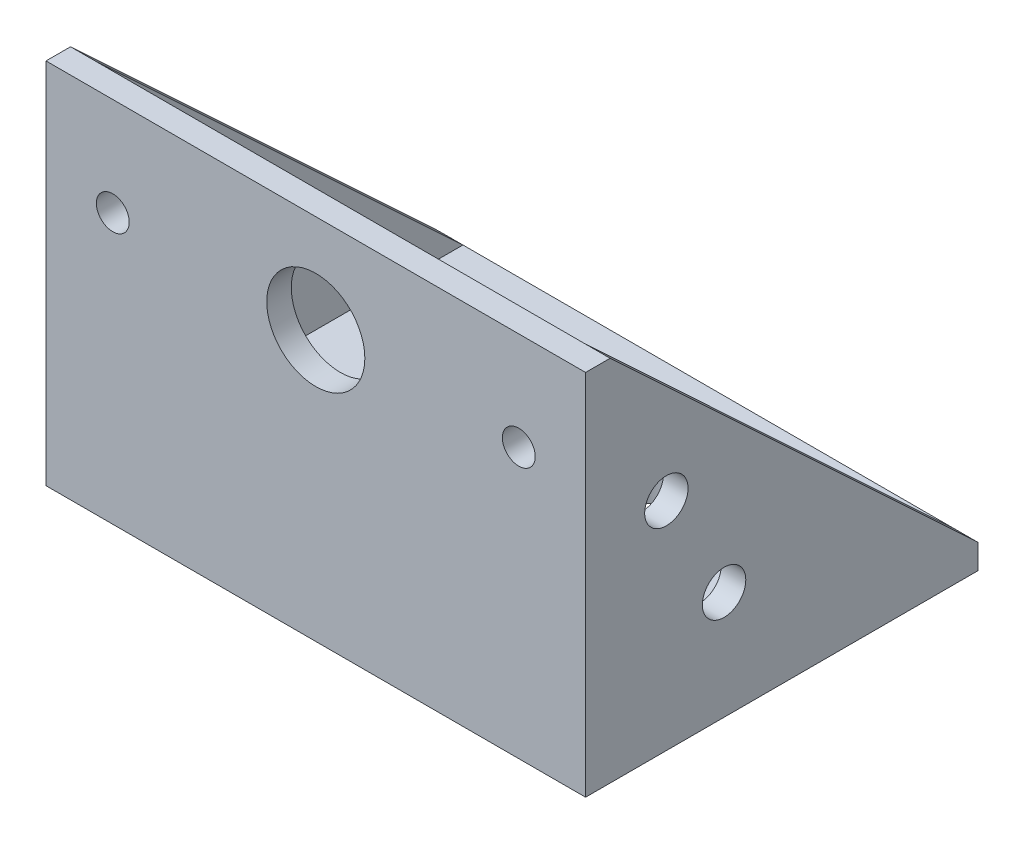
ISO-10303-21;
HEADER;
FILE_DESCRIPTION(('STEP AP214'),'2;1');
FILE_NAME('part.step','',(''),(''),'','','');
FILE_SCHEMA(('AUTOMOTIVE_DESIGN { 1 0 10303 214 1 1 1 1 }'));
ENDSEC;
DATA;
#1=APPLICATION_CONTEXT('core data for automotive mechanical design processes');
#2=APPLICATION_PROTOCOL_DEFINITION('international standard','automotive_design',2000,#1);
#3=PRODUCT_CONTEXT('',#1,'mechanical');
#4=PRODUCT('Part','Part','',(#3));
#5=PRODUCT_RELATED_PRODUCT_CATEGORY('part','',(#4));
#6=PRODUCT_DEFINITION_FORMATION('','',#4);
#7=PRODUCT_DEFINITION_CONTEXT('part definition',#1,'design');
#8=PRODUCT_DEFINITION('design','',#6,#7);
#9=PRODUCT_DEFINITION_SHAPE('','',#8);
#10=(LENGTH_UNIT() NAMED_UNIT(*) SI_UNIT(.MILLI.,.METRE.));
#11=(NAMED_UNIT(*) PLANE_ANGLE_UNIT() SI_UNIT($,.RADIAN.));
#12=(NAMED_UNIT(*) SI_UNIT($,.STERADIAN.) SOLID_ANGLE_UNIT());
#13=UNCERTAINTY_MEASURE_WITH_UNIT(LENGTH_MEASURE(1.E-05),#10,'distance_accuracy_value','');
#14=(GEOMETRIC_REPRESENTATION_CONTEXT(3) GLOBAL_UNCERTAINTY_ASSIGNED_CONTEXT((#13)) GLOBAL_UNIT_ASSIGNED_CONTEXT((#10,
#11,#12)) REPRESENTATION_CONTEXT('',''));
#15=CARTESIAN_POINT('',(0.,0.,0.));
#16=DIRECTION('',(0.,0.,1.));
#17=DIRECTION('',(1.,0.,0.));
#18=AXIS2_PLACEMENT_3D('',#15,#16,#17);
#19=CARTESIAN_POINT('',(0.,-2.54,-38.1));
#20=DIRECTION('',(0.,0.,-1.));
#21=DIRECTION('',(-1.,0.,0.));
#22=AXIS2_PLACEMENT_3D('',#19,#20,#21);
#23=PLANE('',#22);
#24=DIRECTION('',(-1.,0.,0.));
#25=VECTOR('',#24,1.);
#26=CARTESIAN_POINT('',(0.,0.,-38.1));
#27=LINE('',#26,#25);
#28=CARTESIAN_POINT('',(50.8,0.,-38.1));
#29=VERTEX_POINT('',#28);
#30=CARTESIAN_POINT('',(0.,0.,-38.1));
#31=VERTEX_POINT('',#30);
#32=EDGE_CURVE('E41',#29,#31,#27,.T.);
#33=ORIENTED_EDGE('',*,*,#32,.F.);
#34=DIRECTION('',(-1.,0.,0.));
#35=VECTOR('',#34,1.);
#36=CARTESIAN_POINT('',(53.34,0.,-38.1));
#37=LINE('',#36,#35);
#38=CARTESIAN_POINT('',(53.34,0.,-38.1));
#39=VERTEX_POINT('',#38);
#40=EDGE_CURVE('E155',#39,#29,#37,.T.);
#41=ORIENTED_EDGE('',*,*,#40,.F.);
#42=DIRECTION('',(0.,1.,0.));
#43=VECTOR('',#42,1.);
#44=CARTESIAN_POINT('',(53.34,-2.54,-38.1));
#45=LINE('',#44,#43);
#46=CARTESIAN_POINT('',(53.34,-2.54,-38.1));
#47=VERTEX_POINT('',#46);
#48=EDGE_CURVE('E153',#47,#39,#45,.T.);
#49=ORIENTED_EDGE('',*,*,#48,.F.);
#50=DIRECTION('',(-1.,0.,0.));
#51=VECTOR('',#50,1.);
#52=CARTESIAN_POINT('',(0.,-2.54,-38.1));
#53=LINE('',#52,#51);
#54=CARTESIAN_POINT('',(-2.54,-2.54,-38.1));
#55=VERTEX_POINT('',#54);
#56=EDGE_CURVE('E11',#47,#55,#53,.T.);
#57=ORIENTED_EDGE('',*,*,#56,.T.);
#58=DIRECTION('',(0.,-1.,0.));
#59=VECTOR('',#58,1.);
#60=CARTESIAN_POINT('',(-2.54,0.,-38.1));
#61=LINE('',#60,#59);
#62=CARTESIAN_POINT('',(-2.54,0.,-38.1));
#63=VERTEX_POINT('',#62);
#64=EDGE_CURVE('E107',#63,#55,#61,.T.);
#65=ORIENTED_EDGE('',*,*,#64,.F.);
#66=DIRECTION('',(1.,0.,0.));
#67=VECTOR('',#66,1.);
#68=CARTESIAN_POINT('',(-2.54,0.,-38.1));
#69=LINE('',#68,#67);
#70=EDGE_CURVE('E103',#63,#31,#69,.T.);
#71=ORIENTED_EDGE('',*,*,#70,.T.);
#72=EDGE_LOOP('',(#33,#41,#49,#57,#65,#71));
#73=FACE_BOUND('',#72,.T.);
#74=ADVANCED_FACE('F33',(#73),#23,.T.);
#75=CARTESIAN_POINT('',(0.,-2.54,-38.1));
#76=DIRECTION('',(0.,-1.,0.));
#77=DIRECTION('',(0.,0.,-1.));
#78=AXIS2_PLACEMENT_3D('',#75,#76,#77);
#79=PLANE('',#78);
#80=CARTESIAN_POINT('',(44.45,-2.54,-25.4));
#81=DIRECTION('',(0.,1.,0.));
#82=DIRECTION('',(0.,0.,1.));
#83=AXIS2_PLACEMENT_3D('',#80,#81,#82);
#84=CIRCLE('',#83,2.2479);
#85=CARTESIAN_POINT('',(44.45,-2.54,-23.1521));
#86=VERTEX_POINT('',#85);
#87=EDGE_CURVE('E196',#86,#86,#84,.T.);
#88=ORIENTED_EDGE('',*,*,#87,.T.);
#89=EDGE_LOOP('',(#88));
#90=FACE_BOUND('',#89,.T.);
#91=CARTESIAN_POINT('',(31.75,-2.54,-25.4));
#92=DIRECTION('',(0.,1.,0.));
#93=DIRECTION('',(0.,0.,1.));
#94=AXIS2_PLACEMENT_3D('',#91,#92,#93);
#95=CIRCLE('',#94,2.2479);
#96=CARTESIAN_POINT('',(31.75,-2.54,-23.1521));
#97=VERTEX_POINT('',#96);
#98=EDGE_CURVE('E202',#97,#97,#95,.T.);
#99=ORIENTED_EDGE('',*,*,#98,.T.);
#100=EDGE_LOOP('',(#99));
#101=FACE_BOUND('',#100,.T.);
#102=CARTESIAN_POINT('',(19.05,-2.54,-25.4));
#103=DIRECTION('',(0.,1.,0.));
#104=DIRECTION('',(0.,0.,1.));
#105=AXIS2_PLACEMENT_3D('',#102,#103,#104);
#106=CIRCLE('',#105,2.2479);
#107=CARTESIAN_POINT('',(19.05,-2.54,-23.1521));
#108=VERTEX_POINT('',#107);
#109=EDGE_CURVE('E208',#108,#108,#106,.T.);
#110=ORIENTED_EDGE('',*,*,#109,.T.);
#111=EDGE_LOOP('',(#110));
#112=FACE_BOUND('',#111,.T.);
#113=CARTESIAN_POINT('',(6.35,-2.54,-25.4));
#114=DIRECTION('',(0.,1.,0.));
#115=DIRECTION('',(0.,0.,1.));
#116=AXIS2_PLACEMENT_3D('',#113,#114,#115);
#117=CIRCLE('',#116,2.2479);
#118=CARTESIAN_POINT('',(6.35,-2.54,-23.1521));
#119=VERTEX_POINT('',#118);
#120=EDGE_CURVE('E214',#119,#119,#117,.T.);
#121=ORIENTED_EDGE('',*,*,#120,.T.);
#122=EDGE_LOOP('',(#121));
#123=FACE_BOUND('',#122,.T.);
#124=DIRECTION('',(1.,0.,0.));
#125=VECTOR('',#124,1.);
#126=CARTESIAN_POINT('',(0.,-2.54,2.54));
#127=LINE('',#126,#125);
#128=CARTESIAN_POINT('',(-2.54,-2.54,2.54));
#129=VERTEX_POINT('',#128);
#130=CARTESIAN_POINT('',(53.34,-2.54,2.54));
#131=VERTEX_POINT('',#130);
#132=EDGE_CURVE('E181',#129,#131,#127,.T.);
#133=ORIENTED_EDGE('',*,*,#132,.F.);
#134=DIRECTION('',(0.,0.,1.));
#135=VECTOR('',#134,1.);
#136=CARTESIAN_POINT('',(-2.54,-2.54,-38.1));
#137=LINE('',#136,#135);
#138=EDGE_CURVE('E241',#55,#129,#137,.T.);
#139=ORIENTED_EDGE('',*,*,#138,.F.);
#140=ORIENTED_EDGE('',*,*,#56,.F.);
#141=DIRECTION('',(0.,0.,-1.));
#142=VECTOR('',#141,1.);
#143=CARTESIAN_POINT('',(53.34,-2.54,2.54));
#144=LINE('',#143,#142);
#145=EDGE_CURVE('E150',#131,#47,#144,.T.);
#146=ORIENTED_EDGE('',*,*,#145,.F.);
#147=EDGE_LOOP('',(#133,#139,#140,#146));
#148=FACE_BOUND('',#147,.T.);
#149=ADVANCED_FACE('F270',(#90,#101,#112,#123,#148),#79,.T.);
#150=CARTESIAN_POINT('',(0.,0.,-38.1));
#151=DIRECTION('',(0.,-1.,0.));
#152=DIRECTION('',(0.,0.,-1.));
#153=AXIS2_PLACEMENT_3D('',#150,#151,#152);
#154=PLANE('',#153);
#155=CARTESIAN_POINT('',(44.45,0.,-25.4));
#156=DIRECTION('',(0.,1.,0.));
#157=DIRECTION('',(0.,0.,1.));
#158=AXIS2_PLACEMENT_3D('',#155,#156,#157);
#159=CIRCLE('',#158,2.2479);
#160=CARTESIAN_POINT('',(44.45,0.,-23.1521));
#161=VERTEX_POINT('',#160);
#162=EDGE_CURVE('E185',#161,#161,#159,.T.);
#163=ORIENTED_EDGE('',*,*,#162,.F.);
#164=EDGE_LOOP('',(#163));
#165=FACE_BOUND('',#164,.T.);
#166=CARTESIAN_POINT('',(31.75,0.,-25.4));
#167=DIRECTION('',(0.,1.,0.));
#168=DIRECTION('',(0.,0.,1.));
#169=AXIS2_PLACEMENT_3D('',#166,#167,#168);
#170=CIRCLE('',#169,2.2479);
#171=CARTESIAN_POINT('',(31.75,0.,-23.1521));
#172=VERTEX_POINT('',#171);
#173=EDGE_CURVE('E199',#172,#172,#170,.T.);
#174=ORIENTED_EDGE('',*,*,#173,.F.);
#175=EDGE_LOOP('',(#174));
#176=FACE_BOUND('',#175,.T.);
#177=CARTESIAN_POINT('',(19.05,0.,-25.4));
#178=DIRECTION('',(0.,1.,0.));
#179=DIRECTION('',(0.,0.,1.));
#180=AXIS2_PLACEMENT_3D('',#177,#178,#179);
#181=CIRCLE('',#180,2.2479);
#182=CARTESIAN_POINT('',(19.05,0.,-23.1521));
#183=VERTEX_POINT('',#182);
#184=EDGE_CURVE('E205',#183,#183,#181,.T.);
#185=ORIENTED_EDGE('',*,*,#184,.F.);
#186=EDGE_LOOP('',(#185));
#187=FACE_BOUND('',#186,.T.);
#188=CARTESIAN_POINT('',(6.35,0.,-25.4));
#189=DIRECTION('',(0.,1.,0.));
#190=DIRECTION('',(0.,0.,1.));
#191=AXIS2_PLACEMENT_3D('',#188,#189,#190);
#192=CIRCLE('',#191,2.2479);
#193=CARTESIAN_POINT('',(6.35,0.,-23.1521));
#194=VERTEX_POINT('',#193);
#195=EDGE_CURVE('E211',#194,#194,#192,.T.);
#196=ORIENTED_EDGE('',*,*,#195,.F.);
#197=EDGE_LOOP('',(#196));
#198=FACE_BOUND('',#197,.T.);
#199=DIRECTION('',(0.,0.,1.));
#200=VECTOR('',#199,1.);
#201=CARTESIAN_POINT('',(0.,0.,0.));
#202=LINE('',#201,#200);
#203=CARTESIAN_POINT('',(0.,0.,0.));
#204=VERTEX_POINT('',#203);
#205=EDGE_CURVE('E217',#31,#204,#202,.T.);
#206=ORIENTED_EDGE('',*,*,#205,.T.);
#207=DIRECTION('',(1.,0.,0.));
#208=VECTOR('',#207,1.);
#209=CARTESIAN_POINT('',(0.,0.,0.));
#210=LINE('',#209,#208);
#211=CARTESIAN_POINT('',(50.8,0.,0.));
#212=VERTEX_POINT('',#211);
#213=EDGE_CURVE('E224',#204,#212,#210,.T.);
#214=ORIENTED_EDGE('',*,*,#213,.T.);
#215=DIRECTION('',(0.,0.,-1.));
#216=VECTOR('',#215,1.);
#217=CARTESIAN_POINT('',(50.8,0.,0.));
#218=LINE('',#217,#216);
#219=EDGE_CURVE('E53',#212,#29,#218,.T.);
#220=ORIENTED_EDGE('',*,*,#219,.T.);
#221=ORIENTED_EDGE('',*,*,#32,.T.);
#222=EDGE_LOOP('',(#206,#214,#220,#221));
#223=FACE_BOUND('',#222,.T.);
#224=ADVANCED_FACE('F228',(#165,#176,#187,#198,#223),#154,.F.);
#225=CARTESIAN_POINT('',(6.35,-2.54,-25.4));
#226=DIRECTION('',(0.,1.,0.));
#227=DIRECTION('',(0.,0.,1.));
#228=AXIS2_PLACEMENT_3D('',#225,#226,#227);
#229=CYLINDRICAL_SURFACE('',#228,2.2479);
#230=ORIENTED_EDGE('',*,*,#120,.F.);
#231=EDGE_LOOP('',(#230));
#232=FACE_BOUND('',#231,.T.);
#233=ORIENTED_EDGE('',*,*,#195,.T.);
#234=EDGE_LOOP('',(#233));
#235=FACE_BOUND('',#234,.T.);
#236=ADVANCED_FACE('F342',(#232,#235),#229,.F.);
#237=CARTESIAN_POINT('',(19.05,-2.54,-25.4));
#238=DIRECTION('',(0.,1.,0.));
#239=DIRECTION('',(0.,0.,1.));
#240=AXIS2_PLACEMENT_3D('',#237,#238,#239);
#241=CYLINDRICAL_SURFACE('',#240,2.2479);
#242=ORIENTED_EDGE('',*,*,#109,.F.);
#243=EDGE_LOOP('',(#242));
#244=FACE_BOUND('',#243,.T.);
#245=ORIENTED_EDGE('',*,*,#184,.T.);
#246=EDGE_LOOP('',(#245));
#247=FACE_BOUND('',#246,.T.);
#248=ADVANCED_FACE('F338',(#244,#247),#241,.F.);
#249=CARTESIAN_POINT('',(31.75,-2.54,-25.4));
#250=DIRECTION('',(0.,1.,0.));
#251=DIRECTION('',(0.,0.,1.));
#252=AXIS2_PLACEMENT_3D('',#249,#250,#251);
#253=CYLINDRICAL_SURFACE('',#252,2.2479);
#254=ORIENTED_EDGE('',*,*,#98,.F.);
#255=EDGE_LOOP('',(#254));
#256=FACE_BOUND('',#255,.T.);
#257=ORIENTED_EDGE('',*,*,#173,.T.);
#258=EDGE_LOOP('',(#257));
#259=FACE_BOUND('',#258,.T.);
#260=ADVANCED_FACE('F334',(#256,#259),#253,.F.);
#261=CARTESIAN_POINT('',(44.45,-2.54,-25.4));
#262=DIRECTION('',(0.,1.,0.));
#263=DIRECTION('',(0.,0.,1.));
#264=AXIS2_PLACEMENT_3D('',#261,#262,#263);
#265=CYLINDRICAL_SURFACE('',#264,2.2479);
#266=ORIENTED_EDGE('',*,*,#87,.F.);
#267=EDGE_LOOP('',(#266));
#268=FACE_BOUND('',#267,.T.);
#269=ORIENTED_EDGE('',*,*,#162,.T.);
#270=EDGE_LOOP('',(#269));
#271=FACE_BOUND('',#270,.T.);
#272=ADVANCED_FACE('F313',(#268,#271),#265,.F.);
#273=CARTESIAN_POINT('',(0.,35.56,0.));
#274=DIRECTION('',(0.,0.,-1.));
#275=DIRECTION('',(-1.,0.,0.));
#276=AXIS2_PLACEMENT_3D('',#273,#274,#275);
#277=PLANE('',#276);
#278=CARTESIAN_POINT('',(46.42358,25.4,0.));
#279=DIRECTION('',(0.,0.,1.));
#280=DIRECTION('',(1.,0.,0.));
#281=AXIS2_PLACEMENT_3D('',#278,#279,#280);
#282=CIRCLE('',#281,1.7018);
#283=CARTESIAN_POINT('',(48.12538,25.4,0.));
#284=VERTEX_POINT('',#283);
#285=EDGE_CURVE('E162',#284,#284,#282,.T.);
#286=ORIENTED_EDGE('',*,*,#285,.T.);
#287=EDGE_LOOP('',(#286));
#288=FACE_BOUND('',#287,.T.);
#289=CARTESIAN_POINT('',(25.4,25.4,0.));
#290=DIRECTION('',(0.,0.,1.));
#291=DIRECTION('',(1.,0.,0.));
#292=AXIS2_PLACEMENT_3D('',#289,#290,#291);
#293=CIRCLE('',#292,5.08);
#294=CARTESIAN_POINT('',(30.48,25.4,0.));
#295=VERTEX_POINT('',#294);
#296=EDGE_CURVE('E172',#295,#295,#293,.T.);
#297=ORIENTED_EDGE('',*,*,#296,.T.);
#298=EDGE_LOOP('',(#297));
#299=FACE_BOUND('',#298,.T.);
#300=CARTESIAN_POINT('',(4.37642,25.4,0.));
#301=DIRECTION('',(0.,0.,1.));
#302=DIRECTION('',(1.,0.,0.));
#303=AXIS2_PLACEMENT_3D('',#300,#301,#302);
#304=CIRCLE('',#303,1.7018);
#305=CARTESIAN_POINT('',(6.07822,25.4,0.));
#306=VERTEX_POINT('',#305);
#307=EDGE_CURVE('E166',#306,#306,#304,.T.);
#308=ORIENTED_EDGE('',*,*,#307,.T.);
#309=EDGE_LOOP('',(#308));
#310=FACE_BOUND('',#309,.T.);
#311=ORIENTED_EDGE('',*,*,#213,.F.);
#312=DIRECTION('',(0.,-1.,0.));
#313=VECTOR('',#312,1.);
#314=CARTESIAN_POINT('',(0.,-2.54,0.));
#315=LINE('',#314,#313);
#316=CARTESIAN_POINT('',(0.,35.56,0.));
#317=VERTEX_POINT('',#316);
#318=EDGE_CURVE('E178',#317,#204,#315,.T.);
#319=ORIENTED_EDGE('',*,*,#318,.F.);
#320=DIRECTION('',(-1.,0.,0.));
#321=VECTOR('',#320,1.);
#322=CARTESIAN_POINT('',(0.,35.56,0.));
#323=LINE('',#322,#321);
#324=CARTESIAN_POINT('',(50.8,35.56,0.));
#325=VERTEX_POINT('',#324);
#326=EDGE_CURVE('E122',#325,#317,#323,.T.);
#327=ORIENTED_EDGE('',*,*,#326,.F.);
#328=DIRECTION('',(0.,1.,0.));
#329=VECTOR('',#328,1.);
#330=CARTESIAN_POINT('',(50.8,-2.54,0.));
#331=LINE('',#330,#329);
#332=EDGE_CURVE('E193',#212,#325,#331,.T.);
#333=ORIENTED_EDGE('',*,*,#332,.F.);
#334=EDGE_LOOP('',(#311,#319,#327,#333));
#335=FACE_BOUND('',#334,.T.);
#336=ADVANCED_FACE('F232',(#288,#299,#310,#335),#277,.T.);
#337=CARTESIAN_POINT('',(0.,35.56,2.54));
#338=DIRECTION('',(0.,0.,-1.));
#339=DIRECTION('',(-1.,0.,0.));
#340=AXIS2_PLACEMENT_3D('',#337,#338,#339);
#341=PLANE('',#340);
#342=CARTESIAN_POINT('',(4.37642,25.4,2.54));
#343=DIRECTION('',(0.,0.,1.));
#344=DIRECTION('',(1.,0.,0.));
#345=AXIS2_PLACEMENT_3D('',#342,#343,#344);
#346=CIRCLE('',#345,1.7018);
#347=CARTESIAN_POINT('',(6.07822,25.4,2.54));
#348=VERTEX_POINT('',#347);
#349=EDGE_CURVE('E169',#348,#348,#346,.T.);
#350=ORIENTED_EDGE('',*,*,#349,.F.);
#351=EDGE_LOOP('',(#350));
#352=FACE_BOUND('',#351,.T.);
#353=DIRECTION('',(-1.,0.,0.));
#354=VECTOR('',#353,1.);
#355=CARTESIAN_POINT('',(0.,35.56,2.54));
#356=LINE('',#355,#354);
#357=CARTESIAN_POINT('',(53.34,35.56,2.54));
#358=VERTEX_POINT('',#357);
#359=CARTESIAN_POINT('',(-2.54,35.56,2.54));
#360=VERTEX_POINT('',#359);
#361=EDGE_CURVE('E183',#358,#360,#356,.T.);
#362=ORIENTED_EDGE('',*,*,#361,.T.);
#363=DIRECTION('',(0.,1.,0.));
#364=VECTOR('',#363,1.);
#365=CARTESIAN_POINT('',(-2.54,-2.54,2.54));
#366=LINE('',#365,#364);
#367=EDGE_CURVE('E116',#129,#360,#366,.T.);
#368=ORIENTED_EDGE('',*,*,#367,.F.);
#369=ORIENTED_EDGE('',*,*,#132,.T.);
#370=DIRECTION('',(0.,-1.,0.));
#371=VECTOR('',#370,1.);
#372=CARTESIAN_POINT('',(53.34,35.56,2.54));
#373=LINE('',#372,#371);
#374=EDGE_CURVE('E147',#358,#131,#373,.T.);
#375=ORIENTED_EDGE('',*,*,#374,.F.);
#376=EDGE_LOOP('',(#362,#368,#369,#375));
#377=FACE_BOUND('',#376,.T.);
#378=CARTESIAN_POINT('',(25.4,25.4,2.54));
#379=DIRECTION('',(0.,0.,1.));
#380=DIRECTION('',(1.,0.,0.));
#381=AXIS2_PLACEMENT_3D('',#378,#379,#380);
#382=CIRCLE('',#381,5.08);
#383=CARTESIAN_POINT('',(30.48,25.4,2.54));
#384=VERTEX_POINT('',#383);
#385=EDGE_CURVE('E175',#384,#384,#382,.T.);
#386=ORIENTED_EDGE('',*,*,#385,.F.);
#387=EDGE_LOOP('',(#386));
#388=FACE_BOUND('',#387,.T.);
#389=CARTESIAN_POINT('',(46.42358,25.4,2.54));
#390=DIRECTION('',(0.,0.,1.));
#391=DIRECTION('',(1.,0.,0.));
#392=AXIS2_PLACEMENT_3D('',#389,#390,#391);
#393=CIRCLE('',#392,1.7018);
#394=CARTESIAN_POINT('',(48.12538,25.4,2.54));
#395=VERTEX_POINT('',#394);
#396=EDGE_CURVE('E163',#395,#395,#393,.T.);
#397=ORIENTED_EDGE('',*,*,#396,.F.);
#398=EDGE_LOOP('',(#397));
#399=FACE_BOUND('',#398,.T.);
#400=ADVANCED_FACE('F295',(#352,#377,#388,#399),#341,.F.);
#401=CARTESIAN_POINT('',(0.,35.56,2.54));
#402=DIRECTION('',(0.,-1.,0.));
#403=DIRECTION('',(0.,0.,-1.));
#404=AXIS2_PLACEMENT_3D('',#401,#402,#403);
#405=PLANE('',#404);
#406=ORIENTED_EDGE('',*,*,#326,.T.);
#407=DIRECTION('',(1.,0.,0.));
#408=VECTOR('',#407,1.);
#409=CARTESIAN_POINT('',(-2.54,35.56,0.));
#410=LINE('',#409,#408);
#411=CARTESIAN_POINT('',(-2.54,35.56,0.));
#412=VERTEX_POINT('',#411);
#413=EDGE_CURVE('E101',#412,#317,#410,.T.);
#414=ORIENTED_EDGE('',*,*,#413,.F.);
#415=DIRECTION('',(0.,0.,-1.));
#416=VECTOR('',#415,1.);
#417=CARTESIAN_POINT('',(-2.54,35.56,2.54));
#418=LINE('',#417,#416);
#419=EDGE_CURVE('E108',#360,#412,#418,.T.);
#420=ORIENTED_EDGE('',*,*,#419,.F.);
#421=ORIENTED_EDGE('',*,*,#361,.F.);
#422=DIRECTION('',(0.,0.,1.));
#423=VECTOR('',#422,1.);
#424=CARTESIAN_POINT('',(53.34,35.56,0.));
#425=LINE('',#424,#423);
#426=CARTESIAN_POINT('',(53.34,35.56,0.));
#427=VERTEX_POINT('',#426);
#428=EDGE_CURVE('E144',#427,#358,#425,.T.);
#429=ORIENTED_EDGE('',*,*,#428,.F.);
#430=DIRECTION('',(-1.,0.,0.));
#431=VECTOR('',#430,1.);
#432=CARTESIAN_POINT('',(53.34,35.56,0.));
#433=LINE('',#432,#431);
#434=EDGE_CURVE('E160',#427,#325,#433,.T.);
#435=ORIENTED_EDGE('',*,*,#434,.T.);
#436=EDGE_LOOP('',(#406,#414,#420,#421,#429,#435));
#437=FACE_BOUND('',#436,.T.);
#438=ADVANCED_FACE('F120',(#437),#405,.F.);
#439=CARTESIAN_POINT('',(25.4,25.4,2.54));
#440=DIRECTION('',(0.,0.,-1.));
#441=DIRECTION('',(-1.,0.,0.));
#442=AXIS2_PLACEMENT_3D('',#439,#440,#441);
#443=CYLINDRICAL_SURFACE('',#442,5.08);
#444=ORIENTED_EDGE('',*,*,#385,.T.);
#445=EDGE_LOOP('',(#444));
#446=FACE_BOUND('',#445,.T.);
#447=ORIENTED_EDGE('',*,*,#296,.F.);
#448=EDGE_LOOP('',(#447));
#449=FACE_BOUND('',#448,.T.);
#450=ADVANCED_FACE('F320',(#446,#449),#443,.F.);
#451=CARTESIAN_POINT('',(4.37642,25.4,2.54));
#452=DIRECTION('',(0.,0.,-1.));
#453=DIRECTION('',(-1.,0.,0.));
#454=AXIS2_PLACEMENT_3D('',#451,#452,#453);
#455=CYLINDRICAL_SURFACE('',#454,1.7018);
#456=ORIENTED_EDGE('',*,*,#349,.T.);
#457=EDGE_LOOP('',(#456));
#458=FACE_BOUND('',#457,.T.);
#459=ORIENTED_EDGE('',*,*,#307,.F.);
#460=EDGE_LOOP('',(#459));
#461=FACE_BOUND('',#460,.T.);
#462=ADVANCED_FACE('F307',(#458,#461),#455,.F.);
#463=CARTESIAN_POINT('',(46.42358,25.4,2.54));
#464=DIRECTION('',(0.,0.,-1.));
#465=DIRECTION('',(-1.,0.,0.));
#466=AXIS2_PLACEMENT_3D('',#463,#464,#465);
#467=CYLINDRICAL_SURFACE('',#466,1.7018);
#468=ORIENTED_EDGE('',*,*,#396,.T.);
#469=EDGE_LOOP('',(#468));
#470=FACE_BOUND('',#469,.T.);
#471=ORIENTED_EDGE('',*,*,#285,.F.);
#472=EDGE_LOOP('',(#471));
#473=FACE_BOUND('',#472,.T.);
#474=ADVANCED_FACE('F304',(#470,#473),#467,.F.);
#475=CARTESIAN_POINT('',(53.34,37.9306666666667,2.54));
#476=DIRECTION('',(1.,0.,0.));
#477=DIRECTION('',(0.,0.,-1.));
#478=AXIS2_PLACEMENT_3D('',#475,#476,#477);
#479=PLANE('',#478);
#480=CARTESIAN_POINT('',(53.34,8.66588235294118,-11.8035294117647));
#481=DIRECTION('',(1.,0.,0.));
#482=DIRECTION('',(0.,0.,-1.));
#483=AXIS2_PLACEMENT_3D('',#480,#481,#482);
#484=CIRCLE('',#483,2.2479);
#485=CARTESIAN_POINT('',(53.34,8.66588235294118,-14.0514294117647));
#486=VERTEX_POINT('',#485);
#487=EDGE_CURVE('E135',#486,#486,#484,.T.);
#488=ORIENTED_EDGE('',*,*,#487,.F.);
#489=EDGE_LOOP('',(#488));
#490=FACE_BOUND('',#489,.T.);
#491=DIRECTION('',(0.,0.682318250360011,0.731055268242869));
#492=VECTOR('',#491,1.);
#493=CARTESIAN_POINT('',(53.34,0.,-38.1));
#494=LINE('',#493,#492);
#495=EDGE_CURVE('E141',#39,#427,#494,.T.);
#496=ORIENTED_EDGE('',*,*,#495,.T.);
#497=ORIENTED_EDGE('',*,*,#428,.T.);
#498=ORIENTED_EDGE('',*,*,#374,.T.);
#499=ORIENTED_EDGE('',*,*,#145,.T.);
#500=ORIENTED_EDGE('',*,*,#48,.T.);
#501=EDGE_LOOP('',(#496,#497,#498,#499,#500));
#502=FACE_BOUND('',#501,.T.);
#503=CARTESIAN_POINT('',(53.34,19.8717647058824,-5.82705882352941));
#504=DIRECTION('',(1.,0.,0.));
#505=DIRECTION('',(0.,0.,-1.));
#506=AXIS2_PLACEMENT_3D('',#503,#504,#505);
#507=CIRCLE('',#506,2.2479);
#508=CARTESIAN_POINT('',(53.34,19.8717647058824,-8.07495882352941));
#509=VERTEX_POINT('',#508);
#510=EDGE_CURVE('E127',#509,#509,#507,.T.);
#511=ORIENTED_EDGE('',*,*,#510,.F.);
#512=EDGE_LOOP('',(#511));
#513=FACE_BOUND('',#512,.T.);
#514=ADVANCED_FACE('F289',(#490,#502,#513),#479,.T.);
#515=CARTESIAN_POINT('',(50.8,37.9306666666667,2.54));
#516=DIRECTION('',(1.,0.,0.));
#517=DIRECTION('',(0.,0.,-1.));
#518=AXIS2_PLACEMENT_3D('',#515,#516,#517);
#519=PLANE('',#518);
#520=ORIENTED_EDGE('',*,*,#219,.F.);
#521=ORIENTED_EDGE('',*,*,#332,.T.);
#522=DIRECTION('',(0.,0.682318250360011,0.731055268242869));
#523=VECTOR('',#522,1.);
#524=CARTESIAN_POINT('',(50.8,0.,-38.1));
#525=LINE('',#524,#523);
#526=EDGE_CURVE('E138',#29,#325,#525,.T.);
#527=ORIENTED_EDGE('',*,*,#526,.F.);
#528=EDGE_LOOP('',(#520,#521,#527));
#529=FACE_BOUND('',#528,.T.);
#530=CARTESIAN_POINT('',(50.8,8.66588235294118,-11.8035294117647));
#531=DIRECTION('',(1.,0.,0.));
#532=DIRECTION('',(0.,0.,-1.));
#533=AXIS2_PLACEMENT_3D('',#530,#531,#532);
#534=CIRCLE('',#533,2.2479);
#535=CARTESIAN_POINT('',(50.8,8.66588235294118,-14.0514294117647));
#536=VERTEX_POINT('',#535);
#537=EDGE_CURVE('E133',#536,#536,#534,.T.);
#538=ORIENTED_EDGE('',*,*,#537,.T.);
#539=EDGE_LOOP('',(#538));
#540=FACE_BOUND('',#539,.T.);
#541=CARTESIAN_POINT('',(50.8,19.8717647058824,-5.82705882352941));
#542=DIRECTION('',(1.,0.,0.));
#543=DIRECTION('',(0.,0.,-1.));
#544=AXIS2_PLACEMENT_3D('',#541,#542,#543);
#545=CIRCLE('',#544,2.2479);
#546=CARTESIAN_POINT('',(50.8,19.8717647058824,-8.07495882352941));
#547=VERTEX_POINT('',#546);
#548=EDGE_CURVE('E124',#547,#547,#545,.T.);
#549=ORIENTED_EDGE('',*,*,#548,.T.);
#550=EDGE_LOOP('',(#549));
#551=FACE_BOUND('',#550,.T.);
#552=ADVANCED_FACE('F285',(#529,#540,#551),#519,.F.);
#553=CARTESIAN_POINT('',(53.34,0.,-38.1));
#554=DIRECTION('',(0.,-0.731055268242869,0.682318250360011));
#555=DIRECTION('',(0.,-0.682318250360011,-0.731055268242869));
#556=AXIS2_PLACEMENT_3D('',#553,#554,#555);
#557=PLANE('',#556);
#558=ORIENTED_EDGE('',*,*,#526,.T.);
#559=ORIENTED_EDGE('',*,*,#434,.F.);
#560=ORIENTED_EDGE('',*,*,#495,.F.);
#561=ORIENTED_EDGE('',*,*,#40,.T.);
#562=EDGE_LOOP('',(#558,#559,#560,#561));
#563=FACE_BOUND('',#562,.T.);
#564=ADVANCED_FACE('F282',(#563),#557,.F.);
#565=CARTESIAN_POINT('',(53.34,8.66588235294118,-11.8035294117647));
#566=DIRECTION('',(-1.,0.,0.));
#567=DIRECTION('',(0.,0.,1.));
#568=AXIS2_PLACEMENT_3D('',#565,#566,#567);
#569=CYLINDRICAL_SURFACE('',#568,2.2479);
#570=ORIENTED_EDGE('',*,*,#487,.T.);
#571=EDGE_LOOP('',(#570));
#572=FACE_BOUND('',#571,.T.);
#573=ORIENTED_EDGE('',*,*,#537,.F.);
#574=EDGE_LOOP('',(#573));
#575=FACE_BOUND('',#574,.T.);
#576=ADVANCED_FACE('F264',(#572,#575),#569,.F.);
#577=CARTESIAN_POINT('',(53.34,19.8717647058824,-5.82705882352941));
#578=DIRECTION('',(-1.,0.,0.));
#579=DIRECTION('',(0.,0.,1.));
#580=AXIS2_PLACEMENT_3D('',#577,#578,#579);
#581=CYLINDRICAL_SURFACE('',#580,2.2479);
#582=ORIENTED_EDGE('',*,*,#510,.T.);
#583=EDGE_LOOP('',(#582));
#584=FACE_BOUND('',#583,.T.);
#585=ORIENTED_EDGE('',*,*,#548,.F.);
#586=EDGE_LOOP('',(#585));
#587=FACE_BOUND('',#586,.T.);
#588=ADVANCED_FACE('F256',(#584,#587),#581,.F.);
#589=CARTESIAN_POINT('',(-2.54,35.56,-38.1));
#590=DIRECTION('',(-1.,0.,0.));
#591=DIRECTION('',(0.,0.,1.));
#592=AXIS2_PLACEMENT_3D('',#589,#590,#591);
#593=PLANE('',#592);
#594=CARTESIAN_POINT('',(-2.54,8.66588235294118,-11.8035294117647));
#595=DIRECTION('',(-1.,0.,0.));
#596=DIRECTION('',(0.,0.,1.));
#597=AXIS2_PLACEMENT_3D('',#594,#595,#596);
#598=CIRCLE('',#597,2.25933);
#599=CARTESIAN_POINT('',(-2.54,8.66588235294118,-9.5441994117647));
#600=VERTEX_POINT('',#599);
#601=EDGE_CURVE('E235',#600,#600,#598,.T.);
#602=ORIENTED_EDGE('',*,*,#601,.F.);
#603=EDGE_LOOP('',(#602));
#604=FACE_BOUND('',#603,.T.);
#605=ORIENTED_EDGE('',*,*,#419,.T.);
#606=DIRECTION('',(0.,-0.682318250360011,-0.731055268242869));
#607=VECTOR('',#606,1.);
#608=CARTESIAN_POINT('',(-2.54,35.56,0.));
#609=LINE('',#608,#607);
#610=EDGE_CURVE('E96',#412,#63,#609,.T.);
#611=ORIENTED_EDGE('',*,*,#610,.T.);
#612=ORIENTED_EDGE('',*,*,#64,.T.);
#613=ORIENTED_EDGE('',*,*,#138,.T.);
#614=ORIENTED_EDGE('',*,*,#367,.T.);
#615=EDGE_LOOP('',(#605,#611,#612,#613,#614));
#616=FACE_BOUND('',#615,.T.);
#617=CARTESIAN_POINT('',(-2.54,19.8717647058824,-5.82705882352941));
#618=DIRECTION('',(-1.,0.,0.));
#619=DIRECTION('',(0.,0.,1.));
#620=AXIS2_PLACEMENT_3D('',#617,#618,#619);
#621=CIRCLE('',#620,2.2479);
#622=CARTESIAN_POINT('',(-2.54,19.8717647058824,-3.57915882352941));
#623=VERTEX_POINT('',#622);
#624=EDGE_CURVE('E245',#623,#623,#621,.T.);
#625=ORIENTED_EDGE('',*,*,#624,.F.);
#626=EDGE_LOOP('',(#625));
#627=FACE_BOUND('',#626,.T.);
#628=ADVANCED_FACE('F112',(#604,#616,#627),#593,.T.);
#629=CARTESIAN_POINT('',(0.,35.56,-38.1));
#630=DIRECTION('',(-1.,0.,0.));
#631=DIRECTION('',(0.,0.,1.));
#632=AXIS2_PLACEMENT_3D('',#629,#630,#631);
#633=PLANE('',#632);
#634=ORIENTED_EDGE('',*,*,#205,.F.);
#635=DIRECTION('',(0.,-0.682318250360011,-0.731055268242869));
#636=VECTOR('',#635,1.);
#637=CARTESIAN_POINT('',(0.,35.56,0.));
#638=LINE('',#637,#636);
#639=EDGE_CURVE('E118',#317,#31,#638,.T.);
#640=ORIENTED_EDGE('',*,*,#639,.F.);
#641=ORIENTED_EDGE('',*,*,#318,.T.);
#642=EDGE_LOOP('',(#634,#640,#641));
#643=FACE_BOUND('',#642,.T.);
#644=CARTESIAN_POINT('',(0.,8.66588235294118,-11.8035294117647));
#645=DIRECTION('',(-1.,0.,0.));
#646=DIRECTION('',(0.,0.,1.));
#647=AXIS2_PLACEMENT_3D('',#644,#645,#646);
#648=CIRCLE('',#647,2.25933);
#649=CARTESIAN_POINT('',(0.,8.66588235294118,-9.5441994117647));
#650=VERTEX_POINT('',#649);
#651=EDGE_CURVE('E237',#650,#650,#648,.T.);
#652=ORIENTED_EDGE('',*,*,#651,.T.);
#653=EDGE_LOOP('',(#652));
#654=FACE_BOUND('',#653,.T.);
#655=CARTESIAN_POINT('',(0.,19.8717647058824,-5.82705882352941));
#656=DIRECTION('',(-1.,0.,0.));
#657=DIRECTION('',(0.,0.,1.));
#658=AXIS2_PLACEMENT_3D('',#655,#656,#657);
#659=CIRCLE('',#658,2.2479);
#660=CARTESIAN_POINT('',(0.,19.8717647058824,-3.57915882352941));
#661=VERTEX_POINT('',#660);
#662=EDGE_CURVE('E247',#661,#661,#659,.T.);
#663=ORIENTED_EDGE('',*,*,#662,.T.);
#664=EDGE_LOOP('',(#663));
#665=FACE_BOUND('',#664,.T.);
#666=ADVANCED_FACE('F233',(#643,#654,#665),#633,.F.);
#667=CARTESIAN_POINT('',(-2.54,35.56,0.));
#668=DIRECTION('',(0.,-0.731055268242869,0.682318250360011));
#669=DIRECTION('',(0.,-0.682318250360011,-0.731055268242869));
#670=AXIS2_PLACEMENT_3D('',#667,#668,#669);
#671=PLANE('',#670);
#672=ORIENTED_EDGE('',*,*,#639,.T.);
#673=ORIENTED_EDGE('',*,*,#70,.F.);
#674=ORIENTED_EDGE('',*,*,#610,.F.);
#675=ORIENTED_EDGE('',*,*,#413,.T.);
#676=EDGE_LOOP('',(#672,#673,#674,#675));
#677=FACE_BOUND('',#676,.T.);
#678=ADVANCED_FACE('F99',(#677),#671,.F.);
#679=CARTESIAN_POINT('',(-2.54,8.66588235294118,-11.8035294117647));
#680=DIRECTION('',(1.,0.,0.));
#681=DIRECTION('',(0.,0.,-1.));
#682=AXIS2_PLACEMENT_3D('',#679,#680,#681);
#683=CYLINDRICAL_SURFACE('',#682,2.25933);
#684=ORIENTED_EDGE('',*,*,#601,.T.);
#685=EDGE_LOOP('',(#684));
#686=FACE_BOUND('',#685,.T.);
#687=ORIENTED_EDGE('',*,*,#651,.F.);
#688=EDGE_LOOP('',(#687));
#689=FACE_BOUND('',#688,.T.);
#690=ADVANCED_FACE('F488',(#686,#689),#683,.F.);
#691=CARTESIAN_POINT('',(-2.54,19.8717647058824,-5.82705882352941));
#692=DIRECTION('',(1.,0.,0.));
#693=DIRECTION('',(0.,0.,-1.));
#694=AXIS2_PLACEMENT_3D('',#691,#692,#693);
#695=CYLINDRICAL_SURFACE('',#694,2.2479);
#696=ORIENTED_EDGE('',*,*,#624,.T.);
#697=EDGE_LOOP('',(#696));
#698=FACE_BOUND('',#697,.T.);
#699=ORIENTED_EDGE('',*,*,#662,.F.);
#700=EDGE_LOOP('',(#699));
#701=FACE_BOUND('',#700,.T.);
#702=ADVANCED_FACE('F253',(#698,#701),#695,.F.);
#703=CLOSED_SHELL('',(#74,#149,#224,#236,#248,#260,#272,#336,#400,#438,#450,#462,#474,#514,#552,
#564,#576,#588,#628,#666,#678,#690,#702));
#704=MANIFOLD_SOLID_BREP('B2',#703);
#705=ADVANCED_BREP_SHAPE_REPRESENTATION('',(#18,#704),#14);
#706=SHAPE_DEFINITION_REPRESENTATION(#9,#705);
ENDSEC;
END-ISO-10303-21;
